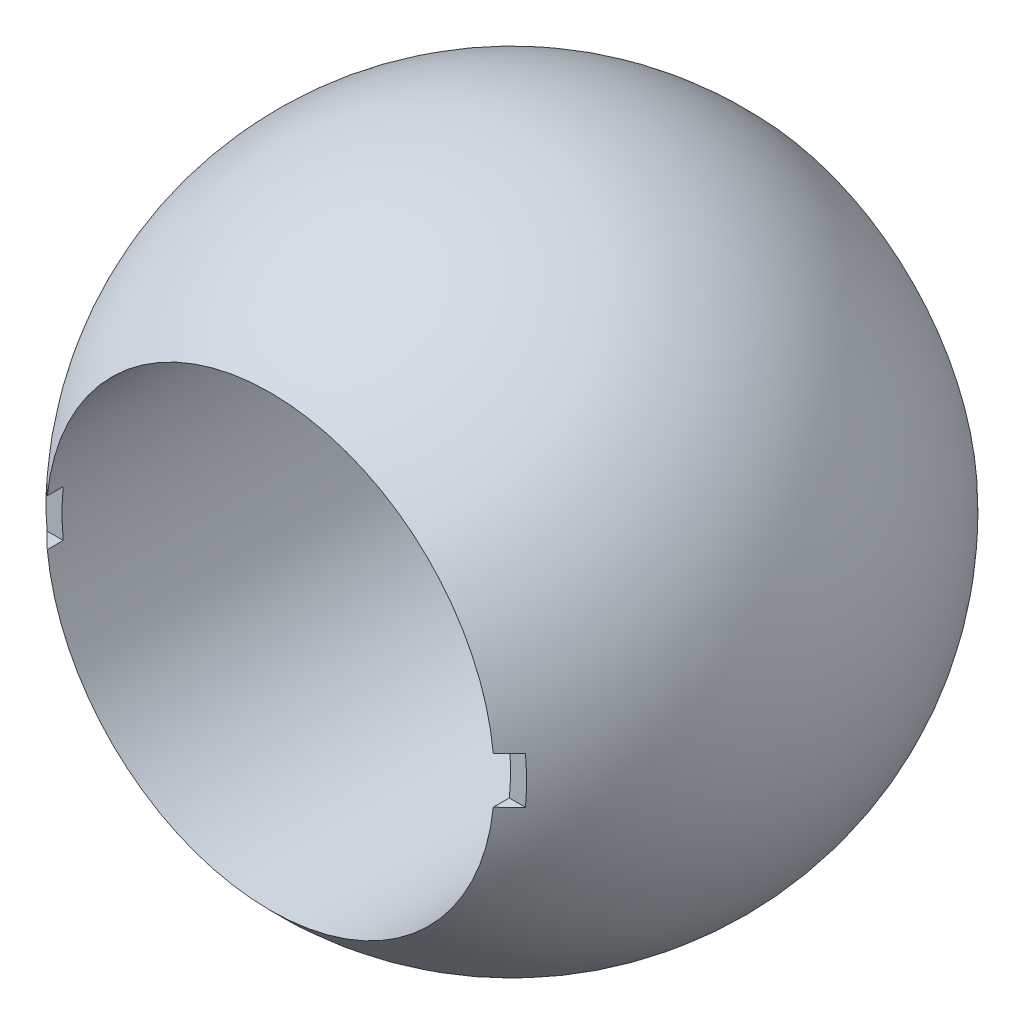
ISO-10303-21;
HEADER;
FILE_DESCRIPTION(('STEP AP214'),'2;1');
FILE_NAME('part.step','',(''),(''),'','','');
FILE_SCHEMA(('AUTOMOTIVE_DESIGN { 1 0 10303 214 1 1 1 1 }'));
ENDSEC;
DATA;
#1=APPLICATION_CONTEXT('core data for automotive mechanical design processes');
#2=APPLICATION_PROTOCOL_DEFINITION('international standard','automotive_design',2000,#1);
#3=PRODUCT_CONTEXT('',#1,'mechanical');
#4=PRODUCT('Part','Part','',(#3));
#5=PRODUCT_RELATED_PRODUCT_CATEGORY('part','',(#4));
#6=PRODUCT_DEFINITION_FORMATION('','',#4);
#7=PRODUCT_DEFINITION_CONTEXT('part definition',#1,'design');
#8=PRODUCT_DEFINITION('design','',#6,#7);
#9=PRODUCT_DEFINITION_SHAPE('','',#8);
#10=(LENGTH_UNIT() NAMED_UNIT(*) SI_UNIT(.MILLI.,.METRE.));
#11=(NAMED_UNIT(*) PLANE_ANGLE_UNIT() SI_UNIT($,.RADIAN.));
#12=(NAMED_UNIT(*) SI_UNIT($,.STERADIAN.) SOLID_ANGLE_UNIT());
#13=UNCERTAINTY_MEASURE_WITH_UNIT(LENGTH_MEASURE(1.E-05),#10,'distance_accuracy_value','');
#14=(GEOMETRIC_REPRESENTATION_CONTEXT(3) GLOBAL_UNCERTAINTY_ASSIGNED_CONTEXT((#13)) GLOBAL_UNIT_ASSIGNED_CONTEXT((#10,
#11,#12)) REPRESENTATION_CONTEXT('',''));
#15=CARTESIAN_POINT('',(0.,0.,0.));
#16=DIRECTION('',(0.,0.,1.));
#17=DIRECTION('',(1.,0.,0.));
#18=AXIS2_PLACEMENT_3D('',#15,#16,#17);
#19=CARTESIAN_POINT('',(0.,0.,0.));
#20=DIRECTION('',(0.,0.,-1.));
#21=DIRECTION('',(1.,0.,0.));
#22=AXIS2_PLACEMENT_3D('',#19,#20,#21);
#23=SPHERICAL_SURFACE('',#22,7.);
#24=CARTESIAN_POINT('',(0.,-0.495278494700884,0.));
#25=DIRECTION('',(0.,-1.,0.));
#26=DIRECTION('',(0.,0.,-1.));
#27=AXIS2_PLACEMENT_3D('',#24,#25,#26);
#28=CIRCLE('',#27,6.98245653138541);
#29=CARTESIAN_POINT('',(-5.07941239584692,-0.495278494700884,4.7910613569024));
#30=VERTEX_POINT('',#29);
#31=CARTESIAN_POINT('',(-4.73667662635807,-0.495278494700884,5.13016508018992));
#32=VERTEX_POINT('',#31);
#33=EDGE_CURVE('E97',#30,#32,#28,.F.);
#34=ORIENTED_EDGE('',*,*,#33,.F.);
#35=CARTESIAN_POINT('',(0.,0.,4.7910613569024));
#36=DIRECTION('',(0.,0.,-1.));
#37=DIRECTION('',(-1.,0.,0.));
#38=AXIS2_PLACEMENT_3D('',#35,#36,#37);
#39=CIRCLE('',#38,5.10350184426307);
#40=CARTESIAN_POINT('',(-5.07941239584692,0.495278494700881,4.7910613569024));
#41=VERTEX_POINT('',#40);
#42=EDGE_CURVE('E102',#41,#30,#39,.F.);
#43=ORIENTED_EDGE('',*,*,#42,.F.);
#44=CARTESIAN_POINT('',(0.,0.495278494700881,0.));
#45=DIRECTION('',(0.,1.,0.));
#46=DIRECTION('',(0.,0.,1.));
#47=AXIS2_PLACEMENT_3D('',#44,#45,#46);
#48=CIRCLE('',#47,6.98245653138541);
#49=CARTESIAN_POINT('',(-4.73667662635807,0.495278494700881,5.13016508018992));
#50=VERTEX_POINT('',#49);
#51=EDGE_CURVE('E89',#50,#41,#48,.F.);
#52=ORIENTED_EDGE('',*,*,#51,.F.);
#53=CARTESIAN_POINT('',(0.,0.,5.13016508018992));
#54=DIRECTION('',(0.,0.,-1.));
#55=DIRECTION('',(-1.,0.,0.));
#56=AXIS2_PLACEMENT_3D('',#53,#54,#55);
#57=CIRCLE('',#56,4.7625);
#58=CARTESIAN_POINT('',(4.73667662635807,0.495278494700881,5.13016508018992));
#59=VERTEX_POINT('',#58);
#60=EDGE_CURVE('E119',#59,#50,#57,.F.);
#61=ORIENTED_EDGE('',*,*,#60,.F.);
#62=CARTESIAN_POINT('',(5.07941239584692,0.495278494700881,4.7910613569024));
#63=VERTEX_POINT('',#62);
#64=EDGE_CURVE('E60',#63,#59,#48,.F.);
#65=ORIENTED_EDGE('',*,*,#64,.F.);
#66=CARTESIAN_POINT('',(5.07941239584692,-0.495278494700884,4.7910613569024));
#67=VERTEX_POINT('',#66);
#68=EDGE_CURVE('E111',#67,#63,#39,.F.);
#69=ORIENTED_EDGE('',*,*,#68,.F.);
#70=CARTESIAN_POINT('',(4.73667662635807,-0.495278494700884,5.13016508018992));
#71=VERTEX_POINT('',#70);
#72=EDGE_CURVE('E112',#71,#67,#28,.F.);
#73=ORIENTED_EDGE('',*,*,#72,.F.);
#74=EDGE_CURVE('E120',#32,#71,#57,.F.);
#75=ORIENTED_EDGE('',*,*,#74,.F.);
#76=EDGE_LOOP('',(#34,#43,#52,#61,#65,#69,#73,#75));
#77=FACE_BOUND('',#76,.T.);
#78=CARTESIAN_POINT('',(0.,0.,-5.13016508018992));
#79=DIRECTION('',(0.,0.,1.));
#80=DIRECTION('',(1.,0.,0.));
#81=AXIS2_PLACEMENT_3D('',#78,#79,#80);
#82=CIRCLE('',#81,4.7625);
#83=CARTESIAN_POINT('',(4.7625,0.,-5.13016508018992));
#84=VERTEX_POINT('',#83);
#85=EDGE_CURVE('E114',#84,#84,#82,.F.);
#86=ORIENTED_EDGE('',*,*,#85,.F.);
#87=EDGE_LOOP('',(#86));
#88=FACE_BOUND('',#87,.T.);
#89=ADVANCED_FACE('F38',(#77,#88),#23,.T.);
#90=CARTESIAN_POINT('',(0.,0.,-7.));
#91=DIRECTION('',(0.,0.,1.));
#92=DIRECTION('',(1.,0.,0.));
#93=AXIS2_PLACEMENT_3D('',#90,#91,#92);
#94=CYLINDRICAL_SURFACE('',#93,4.7625);
#95=CARTESIAN_POINT('',(0.,0.,4.7910613569024));
#96=DIRECTION('',(0.,0.,-1.));
#97=DIRECTION('',(-1.,0.,0.));
#98=AXIS2_PLACEMENT_3D('',#95,#96,#97);
#99=CIRCLE('',#98,4.7625);
#100=CARTESIAN_POINT('',(-4.73667662635807,0.495278494700881,4.7910613569024));
#101=VERTEX_POINT('',#100);
#102=CARTESIAN_POINT('',(-4.73667662635807,-0.495278494700884,4.7910613569024));
#103=VERTEX_POINT('',#102);
#104=EDGE_CURVE('E45',#101,#103,#99,.F.);
#105=ORIENTED_EDGE('',*,*,#104,.T.);
#106=DIRECTION('',(0.,0.,1.));
#107=VECTOR('',#106,1.);
#108=CARTESIAN_POINT('',(-4.73667662635807,-0.495278494700884,-7.));
#109=LINE('',#108,#107);
#110=EDGE_CURVE('E11',#103,#32,#109,.T.);
#111=ORIENTED_EDGE('',*,*,#110,.T.);
#112=ORIENTED_EDGE('',*,*,#74,.T.);
#113=DIRECTION('',(0.,0.,1.));
#114=VECTOR('',#113,1.);
#115=CARTESIAN_POINT('',(4.73667662635807,-0.495278494700884,-7.));
#116=LINE('',#115,#114);
#117=CARTESIAN_POINT('',(4.73667662635807,-0.495278494700884,4.7910613569024));
#118=VERTEX_POINT('',#117);
#119=EDGE_CURVE('E128',#71,#118,#116,.F.);
#120=ORIENTED_EDGE('',*,*,#119,.T.);
#121=CARTESIAN_POINT('',(4.73667662635807,0.495278494700881,4.7910613569024));
#122=VERTEX_POINT('',#121);
#123=EDGE_CURVE('E125',#118,#122,#99,.F.);
#124=ORIENTED_EDGE('',*,*,#123,.T.);
#125=DIRECTION('',(0.,0.,1.));
#126=VECTOR('',#125,1.);
#127=CARTESIAN_POINT('',(4.73667662635807,0.495278494700881,-7.));
#128=LINE('',#127,#126);
#129=EDGE_CURVE('E123',#122,#59,#128,.T.);
#130=ORIENTED_EDGE('',*,*,#129,.T.);
#131=ORIENTED_EDGE('',*,*,#60,.T.);
#132=DIRECTION('',(0.,0.,1.));
#133=VECTOR('',#132,1.);
#134=CARTESIAN_POINT('',(-4.73667662635807,0.495278494700881,-7.));
#135=LINE('',#134,#133);
#136=EDGE_CURVE('E92',#50,#101,#135,.F.);
#137=ORIENTED_EDGE('',*,*,#136,.T.);
#138=EDGE_LOOP('',(#105,#111,#112,#120,#124,#130,#131,#137));
#139=FACE_BOUND('',#138,.T.);
#140=ORIENTED_EDGE('',*,*,#85,.T.);
#141=EDGE_LOOP('',(#140));
#142=FACE_BOUND('',#141,.T.);
#143=ADVANCED_FACE('F131',(#139,#142),#94,.F.);
#144=CARTESIAN_POINT('',(-7.,0.495278494700881,5.46926880347743));
#145=DIRECTION('',(0.,1.,0.));
#146=DIRECTION('',(0.,0.,1.));
#147=AXIS2_PLACEMENT_3D('',#144,#145,#146);
#148=PLANE('',#147);
#149=ORIENTED_EDGE('',*,*,#64,.T.);
#150=ORIENTED_EDGE('',*,*,#129,.F.);
#151=DIRECTION('',(1.,0.,0.));
#152=VECTOR('',#151,1.);
#153=CARTESIAN_POINT('',(-7.,0.495278494700881,4.7910613569024));
#154=LINE('',#153,#152);
#155=EDGE_CURVE('E106',#122,#63,#154,.T.);
#156=ORIENTED_EDGE('',*,*,#155,.T.);
#157=EDGE_LOOP('',(#149,#150,#156));
#158=FACE_BOUND('',#157,.T.);
#159=ADVANCED_FACE('F145',(#158),#148,.F.);
#160=CARTESIAN_POINT('',(-7.,-0.495278494700884,5.46926880347743));
#161=DIRECTION('',(0.,-1.,0.));
#162=DIRECTION('',(0.,0.,-1.));
#163=AXIS2_PLACEMENT_3D('',#160,#161,#162);
#164=PLANE('',#163);
#165=ORIENTED_EDGE('',*,*,#72,.T.);
#166=DIRECTION('',(1.,0.,0.));
#167=VECTOR('',#166,1.);
#168=CARTESIAN_POINT('',(-7.,-0.495278494700884,4.7910613569024));
#169=LINE('',#168,#167);
#170=EDGE_CURVE('E105',#118,#67,#169,.T.);
#171=ORIENTED_EDGE('',*,*,#170,.F.);
#172=ORIENTED_EDGE('',*,*,#119,.F.);
#173=EDGE_LOOP('',(#165,#171,#172));
#174=FACE_BOUND('',#173,.T.);
#175=ADVANCED_FACE('F139',(#174),#164,.F.);
#176=CARTESIAN_POINT('',(-7.,-0.495278494700884,4.7910613569024));
#177=DIRECTION('',(0.,0.,-1.));
#178=DIRECTION('',(-1.,0.,0.));
#179=AXIS2_PLACEMENT_3D('',#176,#177,#178);
#180=PLANE('',#179);
#181=ORIENTED_EDGE('',*,*,#68,.T.);
#182=ORIENTED_EDGE('',*,*,#155,.F.);
#183=ORIENTED_EDGE('',*,*,#123,.F.);
#184=ORIENTED_EDGE('',*,*,#170,.T.);
#185=EDGE_LOOP('',(#181,#182,#183,#184));
#186=FACE_BOUND('',#185,.T.);
#187=ADVANCED_FACE('F141',(#186),#180,.F.);
#188=ORIENTED_EDGE('',*,*,#42,.T.);
#189=EDGE_CURVE('E143',#30,#103,#169,.T.);
#190=ORIENTED_EDGE('',*,*,#189,.T.);
#191=ORIENTED_EDGE('',*,*,#104,.F.);
#192=EDGE_CURVE('E52',#41,#101,#154,.T.);
#193=ORIENTED_EDGE('',*,*,#192,.F.);
#194=EDGE_LOOP('',(#188,#190,#191,#193));
#195=FACE_BOUND('',#194,.T.);
#196=ADVANCED_FACE('F100',(#195),#180,.F.);
#197=ORIENTED_EDGE('',*,*,#51,.T.);
#198=ORIENTED_EDGE('',*,*,#192,.T.);
#199=ORIENTED_EDGE('',*,*,#136,.F.);
#200=EDGE_LOOP('',(#197,#198,#199));
#201=FACE_BOUND('',#200,.T.);
#202=ADVANCED_FACE('F90',(#201),#148,.F.);
#203=ORIENTED_EDGE('',*,*,#33,.T.);
#204=ORIENTED_EDGE('',*,*,#110,.F.);
#205=ORIENTED_EDGE('',*,*,#189,.F.);
#206=EDGE_LOOP('',(#203,#204,#205));
#207=FACE_BOUND('',#206,.T.);
#208=ADVANCED_FACE('F153',(#207),#164,.F.);
#209=CLOSED_SHELL('',(#89,#143,#159,#175,#187,#196,#202,#208));
#210=MANIFOLD_SOLID_BREP('B2',#209);
#211=ADVANCED_BREP_SHAPE_REPRESENTATION('',(#18,#210),#14);
#212=SHAPE_DEFINITION_REPRESENTATION(#9,#211);
ENDSEC;
END-ISO-10303-21;
